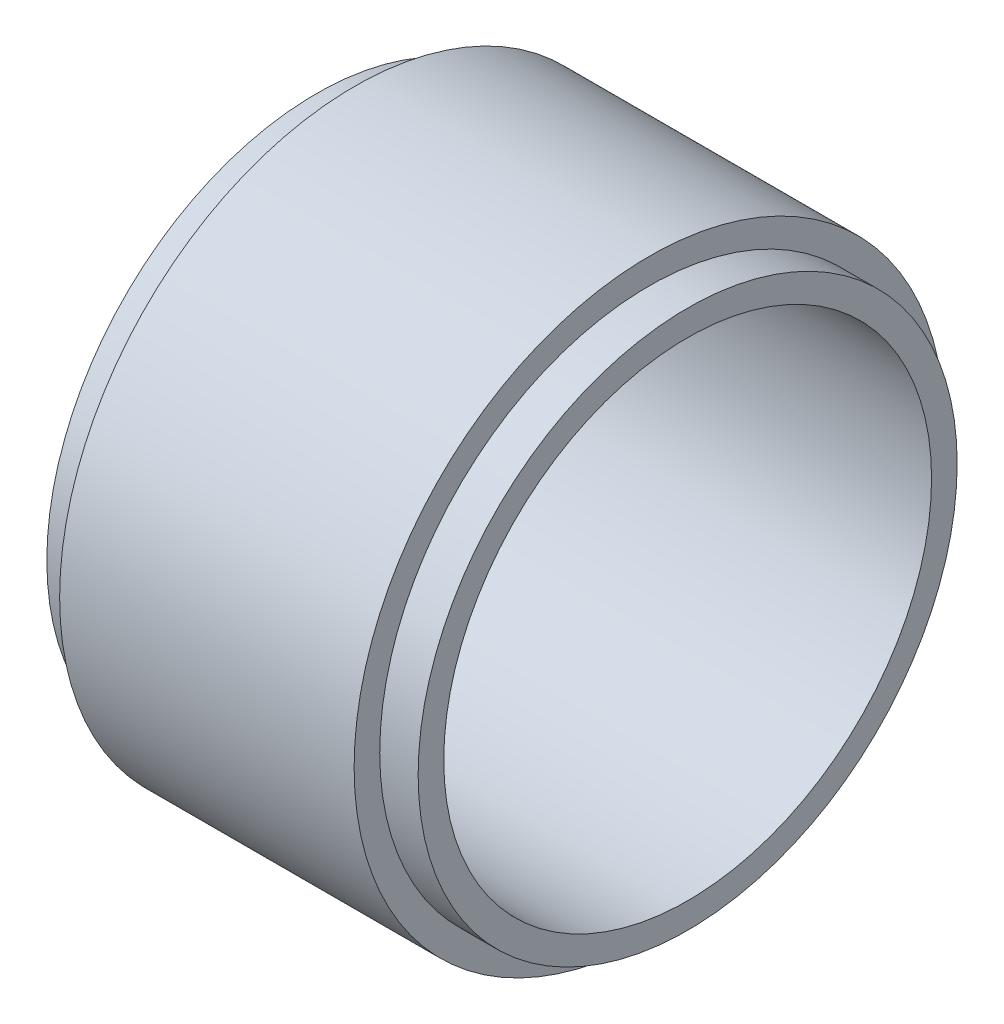
ISO-10303-21;
HEADER;
FILE_DESCRIPTION(('STEP AP214'),'2;1');
FILE_NAME('part.step','',(''),(''),'','','');
FILE_SCHEMA(('AUTOMOTIVE_DESIGN { 1 0 10303 214 1 1 1 1 }'));
ENDSEC;
DATA;
#1=APPLICATION_CONTEXT('core data for automotive mechanical design processes');
#2=APPLICATION_PROTOCOL_DEFINITION('international standard','automotive_design',2000,#1);
#3=PRODUCT_CONTEXT('',#1,'mechanical');
#4=PRODUCT('Part','Part','',(#3));
#5=PRODUCT_RELATED_PRODUCT_CATEGORY('part','',(#4));
#6=PRODUCT_DEFINITION_FORMATION('','',#4);
#7=PRODUCT_DEFINITION_CONTEXT('part definition',#1,'design');
#8=PRODUCT_DEFINITION('design','',#6,#7);
#9=PRODUCT_DEFINITION_SHAPE('','',#8);
#10=(LENGTH_UNIT() NAMED_UNIT(*) SI_UNIT(.MILLI.,.METRE.));
#11=(NAMED_UNIT(*) PLANE_ANGLE_UNIT() SI_UNIT($,.RADIAN.));
#12=(NAMED_UNIT(*) SI_UNIT($,.STERADIAN.) SOLID_ANGLE_UNIT());
#13=UNCERTAINTY_MEASURE_WITH_UNIT(LENGTH_MEASURE(1.E-05),#10,'distance_accuracy_value','');
#14=(GEOMETRIC_REPRESENTATION_CONTEXT(3) GLOBAL_UNCERTAINTY_ASSIGNED_CONTEXT((#13)) GLOBAL_UNIT_ASSIGNED_CONTEXT((#10,
#11,#12)) REPRESENTATION_CONTEXT('',''));
#15=CARTESIAN_POINT('',(0.,0.,0.));
#16=DIRECTION('',(0.,0.,1.));
#17=DIRECTION('',(1.,0.,0.));
#18=AXIS2_PLACEMENT_3D('',#15,#16,#17);
#19=CARTESIAN_POINT('',(0.,19.05,0.));
#20=DIRECTION('',(1.,0.,0.));
#21=DIRECTION('',(0.,0.,-1.));
#22=AXIS2_PLACEMENT_3D('',#19,#20,#21);
#23=PLANE('',#22);
#24=CARTESIAN_POINT('',(0.,0.,0.));
#25=DIRECTION('',(1.,0.,0.));
#26=DIRECTION('',(0.,0.,-1.));
#27=AXIS2_PLACEMENT_3D('',#24,#25,#26);
#28=CIRCLE('',#27,21.05);
#29=CARTESIAN_POINT('',(0.,0.,-21.05));
#30=VERTEX_POINT('',#29);
#31=EDGE_CURVE('E10',#30,#30,#28,.T.);
#32=ORIENTED_EDGE('',*,*,#31,.T.);
#33=EDGE_LOOP('',(#32));
#34=FACE_BOUND('',#33,.T.);
#35=CARTESIAN_POINT('',(0.,0.,0.));
#36=DIRECTION('',(1.,0.,0.));
#37=DIRECTION('',(0.,0.,-1.));
#38=AXIS2_PLACEMENT_3D('',#35,#36,#37);
#39=CIRCLE('',#38,19.05);
#40=CARTESIAN_POINT('',(0.,0.,-19.05));
#41=VERTEX_POINT('',#40);
#42=EDGE_CURVE('E76',#41,#41,#39,.T.);
#43=ORIENTED_EDGE('',*,*,#42,.F.);
#44=EDGE_LOOP('',(#43));
#45=FACE_BOUND('',#44,.T.);
#46=ADVANCED_FACE('F41',(#34,#45),#23,.T.);
#47=CARTESIAN_POINT('',(0.,0.,0.));
#48=DIRECTION('',(1.,0.,0.));
#49=DIRECTION('',(0.,0.,-1.));
#50=AXIS2_PLACEMENT_3D('',#47,#48,#49);
#51=CYLINDRICAL_SURFACE('',#50,21.05);
#52=CARTESIAN_POINT('',(-3.,0.,0.));
#53=DIRECTION('',(1.,0.,0.));
#54=DIRECTION('',(0.,0.,-1.));
#55=AXIS2_PLACEMENT_3D('',#52,#53,#54);
#56=CIRCLE('',#55,21.05);
#57=CARTESIAN_POINT('',(-3.,0.,-21.05));
#58=VERTEX_POINT('',#57);
#59=EDGE_CURVE('E48',#58,#58,#56,.T.);
#60=ORIENTED_EDGE('',*,*,#59,.T.);
#61=EDGE_LOOP('',(#60));
#62=FACE_BOUND('',#61,.T.);
#63=ORIENTED_EDGE('',*,*,#31,.F.);
#64=EDGE_LOOP('',(#63));
#65=FACE_BOUND('',#64,.T.);
#66=ADVANCED_FACE('F85',(#62,#65),#51,.T.);
#67=CARTESIAN_POINT('',(-3.,21.05,0.));
#68=DIRECTION('',(1.,0.,0.));
#69=DIRECTION('',(0.,0.,-1.));
#70=AXIS2_PLACEMENT_3D('',#67,#68,#69);
#71=PLANE('',#70);
#72=CARTESIAN_POINT('',(-3.,0.,0.));
#73=DIRECTION('',(1.,0.,0.));
#74=DIRECTION('',(0.,0.,-1.));
#75=AXIS2_PLACEMENT_3D('',#72,#73,#74);
#76=CIRCLE('',#75,23.05);
#77=CARTESIAN_POINT('',(-3.,0.,-23.05));
#78=VERTEX_POINT('',#77);
#79=EDGE_CURVE('E53',#78,#78,#76,.T.);
#80=ORIENTED_EDGE('',*,*,#79,.T.);
#81=EDGE_LOOP('',(#80));
#82=FACE_BOUND('',#81,.T.);
#83=ORIENTED_EDGE('',*,*,#59,.F.);
#84=EDGE_LOOP('',(#83));
#85=FACE_BOUND('',#84,.T.);
#86=ADVANCED_FACE('F89',(#82,#85),#71,.T.);
#87=CARTESIAN_POINT('',(0.,0.,0.));
#88=DIRECTION('',(1.,0.,0.));
#89=DIRECTION('',(0.,0.,-1.));
#90=AXIS2_PLACEMENT_3D('',#87,#88,#89);
#91=CYLINDRICAL_SURFACE('',#90,23.05);
#92=CARTESIAN_POINT('',(-26.,0.,0.));
#93=DIRECTION('',(1.,0.,0.));
#94=DIRECTION('',(0.,0.,-1.));
#95=AXIS2_PLACEMENT_3D('',#92,#93,#94);
#96=CIRCLE('',#95,23.05);
#97=CARTESIAN_POINT('',(-26.,0.,-23.05));
#98=VERTEX_POINT('',#97);
#99=EDGE_CURVE('E58',#98,#98,#96,.T.);
#100=ORIENTED_EDGE('',*,*,#99,.T.);
#101=EDGE_LOOP('',(#100));
#102=FACE_BOUND('',#101,.T.);
#103=ORIENTED_EDGE('',*,*,#79,.F.);
#104=EDGE_LOOP('',(#103));
#105=FACE_BOUND('',#104,.T.);
#106=ADVANCED_FACE('F93',(#102,#105),#91,.T.);
#107=CARTESIAN_POINT('',(-26.,23.05,0.));
#108=DIRECTION('',(-1.,0.,0.));
#109=DIRECTION('',(0.,0.,1.));
#110=AXIS2_PLACEMENT_3D('',#107,#108,#109);
#111=PLANE('',#110);
#112=CARTESIAN_POINT('',(-26.,0.,0.));
#113=DIRECTION('',(1.,0.,0.));
#114=DIRECTION('',(0.,0.,-1.));
#115=AXIS2_PLACEMENT_3D('',#112,#113,#114);
#116=CIRCLE('',#115,21.05);
#117=CARTESIAN_POINT('',(-26.,0.,-21.05));
#118=VERTEX_POINT('',#117);
#119=EDGE_CURVE('E64',#118,#118,#116,.T.);
#120=ORIENTED_EDGE('',*,*,#119,.T.);
#121=EDGE_LOOP('',(#120));
#122=FACE_BOUND('',#121,.T.);
#123=ORIENTED_EDGE('',*,*,#99,.F.);
#124=EDGE_LOOP('',(#123));
#125=FACE_BOUND('',#124,.T.);
#126=ADVANCED_FACE('F100',(#122,#125),#111,.T.);
#127=CARTESIAN_POINT('',(0.,0.,0.));
#128=DIRECTION('',(1.,0.,0.));
#129=DIRECTION('',(0.,0.,-1.));
#130=AXIS2_PLACEMENT_3D('',#127,#128,#129);
#131=CYLINDRICAL_SURFACE('',#130,21.05);
#132=CARTESIAN_POINT('',(-29.,0.,0.));
#133=DIRECTION('',(1.,0.,0.));
#134=DIRECTION('',(0.,0.,-1.));
#135=AXIS2_PLACEMENT_3D('',#132,#133,#134);
#136=CIRCLE('',#135,21.05);
#137=CARTESIAN_POINT('',(-29.,0.,-21.05));
#138=VERTEX_POINT('',#137);
#139=EDGE_CURVE('E68',#138,#138,#136,.T.);
#140=ORIENTED_EDGE('',*,*,#139,.T.);
#141=EDGE_LOOP('',(#140));
#142=FACE_BOUND('',#141,.T.);
#143=ORIENTED_EDGE('',*,*,#119,.F.);
#144=EDGE_LOOP('',(#143));
#145=FACE_BOUND('',#144,.T.);
#146=ADVANCED_FACE('F104',(#142,#145),#131,.T.);
#147=CARTESIAN_POINT('',(-29.,21.05,0.));
#148=DIRECTION('',(-1.,0.,0.));
#149=DIRECTION('',(0.,0.,1.));
#150=AXIS2_PLACEMENT_3D('',#147,#148,#149);
#151=PLANE('',#150);
#152=CARTESIAN_POINT('',(-29.,0.,0.));
#153=DIRECTION('',(1.,0.,0.));
#154=DIRECTION('',(0.,0.,-1.));
#155=AXIS2_PLACEMENT_3D('',#152,#153,#154);
#156=CIRCLE('',#155,19.05);
#157=CARTESIAN_POINT('',(-29.,0.,-19.05));
#158=VERTEX_POINT('',#157);
#159=EDGE_CURVE('E72',#158,#158,#156,.T.);
#160=ORIENTED_EDGE('',*,*,#159,.T.);
#161=EDGE_LOOP('',(#160));
#162=FACE_BOUND('',#161,.T.);
#163=ORIENTED_EDGE('',*,*,#139,.F.);
#164=EDGE_LOOP('',(#163));
#165=FACE_BOUND('',#164,.T.);
#166=ADVANCED_FACE('F108',(#162,#165),#151,.T.);
#167=CARTESIAN_POINT('',(0.,0.,0.));
#168=DIRECTION('',(1.,0.,0.));
#169=DIRECTION('',(0.,0.,-1.));
#170=AXIS2_PLACEMENT_3D('',#167,#168,#169);
#171=CYLINDRICAL_SURFACE('',#170,19.05);
#172=ORIENTED_EDGE('',*,*,#42,.T.);
#173=EDGE_LOOP('',(#172));
#174=FACE_BOUND('',#173,.T.);
#175=ORIENTED_EDGE('',*,*,#159,.F.);
#176=EDGE_LOOP('',(#175));
#177=FACE_BOUND('',#176,.T.);
#178=ADVANCED_FACE('F81',(#174,#177),#171,.F.);
#179=CLOSED_SHELL('',(#46,#66,#86,#106,#126,#146,#166,#178));
#180=MANIFOLD_SOLID_BREP('B2',#179);
#181=ADVANCED_BREP_SHAPE_REPRESENTATION('',(#18,#180),#14);
#182=SHAPE_DEFINITION_REPRESENTATION(#9,#181);
ENDSEC;
END-ISO-10303-21;
